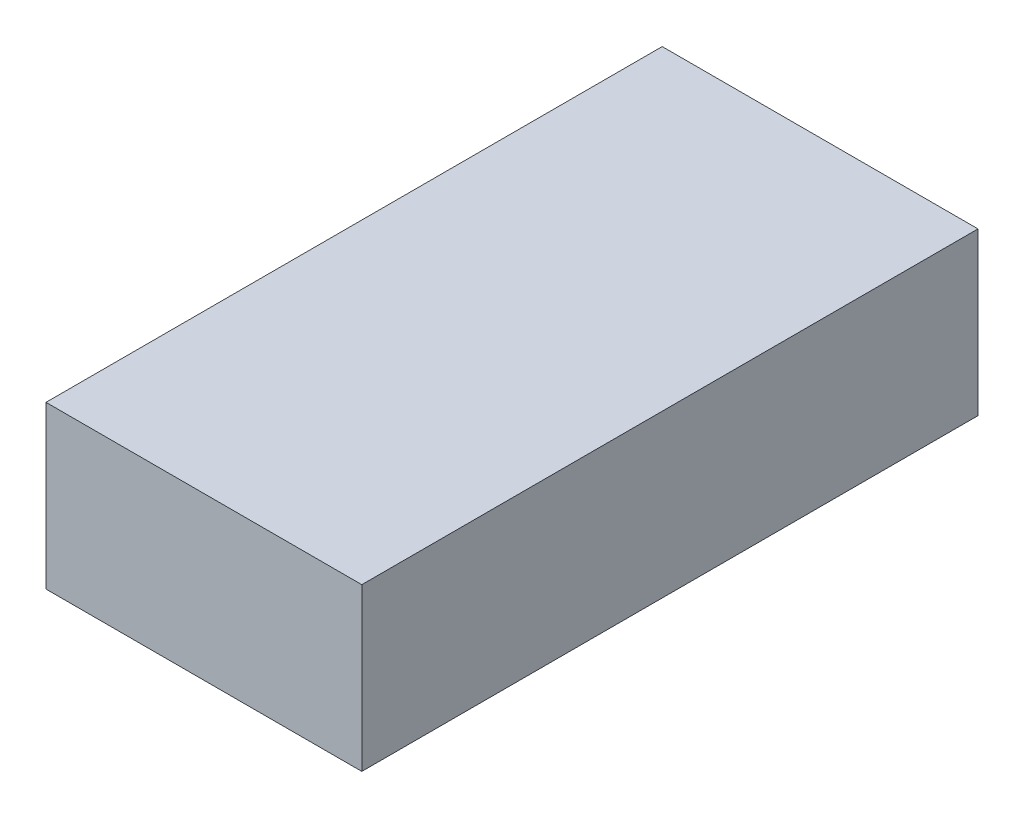
ISO-10303-21;
HEADER;
FILE_DESCRIPTION(('STEP AP214'),'2;1');
FILE_NAME('part.step','',(''),(''),'','','');
FILE_SCHEMA(('AUTOMOTIVE_DESIGN { 1 0 10303 214 1 1 1 1 }'));
ENDSEC;
DATA;
#1=APPLICATION_CONTEXT('core data for automotive mechanical design processes');
#2=APPLICATION_PROTOCOL_DEFINITION('international standard','automotive_design',2000,#1);
#3=PRODUCT_CONTEXT('',#1,'mechanical');
#4=PRODUCT('Part','Part','',(#3));
#5=PRODUCT_RELATED_PRODUCT_CATEGORY('part','',(#4));
#6=PRODUCT_DEFINITION_FORMATION('','',#4);
#7=PRODUCT_DEFINITION_CONTEXT('part definition',#1,'design');
#8=PRODUCT_DEFINITION('design','',#6,#7);
#9=PRODUCT_DEFINITION_SHAPE('','',#8);
#10=(LENGTH_UNIT() NAMED_UNIT(*) SI_UNIT(.MILLI.,.METRE.));
#11=(NAMED_UNIT(*) PLANE_ANGLE_UNIT() SI_UNIT($,.RADIAN.));
#12=(NAMED_UNIT(*) SI_UNIT($,.STERADIAN.) SOLID_ANGLE_UNIT());
#13=UNCERTAINTY_MEASURE_WITH_UNIT(LENGTH_MEASURE(1.E-05),#10,'distance_accuracy_value','');
#14=(GEOMETRIC_REPRESENTATION_CONTEXT(3) GLOBAL_UNCERTAINTY_ASSIGNED_CONTEXT((#13)) GLOBAL_UNIT_ASSIGNED_CONTEXT((#10,
#11,#12)) REPRESENTATION_CONTEXT('',''));
#15=CARTESIAN_POINT('',(0.,0.,0.));
#16=DIRECTION('',(0.,0.,1.));
#17=DIRECTION('',(1.,0.,0.));
#18=AXIS2_PLACEMENT_3D('',#15,#16,#17);
#19=CARTESIAN_POINT('',(20.5,10.5,80.));
#20=DIRECTION('',(-1.,0.,0.));
#21=DIRECTION('',(0.,-1.,0.));
#22=AXIS2_PLACEMENT_3D('',#19,#20,#21);
#23=PLANE('',#22);
#24=DIRECTION('',(0.,1.,0.));
#25=VECTOR('',#24,1.);
#26=CARTESIAN_POINT('',(20.5,10.5,0.));
#27=LINE('',#26,#25);
#28=CARTESIAN_POINT('',(20.5,-10.5,0.));
#29=VERTEX_POINT('',#28);
#30=CARTESIAN_POINT('',(20.5,10.5,0.));
#31=VERTEX_POINT('',#30);
#32=EDGE_CURVE('E94',#29,#31,#27,.T.);
#33=ORIENTED_EDGE('',*,*,#32,.T.);
#34=DIRECTION('',(0.,0.,-1.));
#35=VECTOR('',#34,1.);
#36=CARTESIAN_POINT('',(20.5,10.5,80.));
#37=LINE('',#36,#35);
#38=CARTESIAN_POINT('',(20.5,10.5,80.));
#39=VERTEX_POINT('',#38);
#40=EDGE_CURVE('E11',#39,#31,#37,.T.);
#41=ORIENTED_EDGE('',*,*,#40,.F.);
#42=DIRECTION('',(0.,1.,0.));
#43=VECTOR('',#42,1.);
#44=CARTESIAN_POINT('',(20.5,10.5,80.));
#45=LINE('',#44,#43);
#46=CARTESIAN_POINT('',(20.5,-10.5,80.));
#47=VERTEX_POINT('',#46);
#48=EDGE_CURVE('E82',#47,#39,#45,.T.);
#49=ORIENTED_EDGE('',*,*,#48,.F.);
#50=DIRECTION('',(0.,0.,-1.));
#51=VECTOR('',#50,1.);
#52=CARTESIAN_POINT('',(20.5,-10.5,80.));
#53=LINE('',#52,#51);
#54=EDGE_CURVE('E90',#47,#29,#53,.T.);
#55=ORIENTED_EDGE('',*,*,#54,.T.);
#56=EDGE_LOOP('',(#33,#41,#49,#55));
#57=FACE_BOUND('',#56,.T.);
#58=ADVANCED_FACE('F31',(#57),#23,.F.);
#59=CARTESIAN_POINT('',(-20.5,10.5,80.));
#60=DIRECTION('',(0.,-1.,0.));
#61=DIRECTION('',(0.,0.,-1.));
#62=AXIS2_PLACEMENT_3D('',#59,#60,#61);
#63=PLANE('',#62);
#64=DIRECTION('',(-1.,0.,0.));
#65=VECTOR('',#64,1.);
#66=CARTESIAN_POINT('',(-20.5,10.5,0.));
#67=LINE('',#66,#65);
#68=CARTESIAN_POINT('',(-20.5,10.5,0.));
#69=VERTEX_POINT('',#68);
#70=EDGE_CURVE('E86',#31,#69,#67,.T.);
#71=ORIENTED_EDGE('',*,*,#70,.T.);
#72=DIRECTION('',(0.,0.,-1.));
#73=VECTOR('',#72,1.);
#74=CARTESIAN_POINT('',(-20.5,10.5,80.));
#75=LINE('',#74,#73);
#76=CARTESIAN_POINT('',(-20.5,10.5,80.));
#77=VERTEX_POINT('',#76);
#78=EDGE_CURVE('E39',#77,#69,#75,.T.);
#79=ORIENTED_EDGE('',*,*,#78,.F.);
#80=DIRECTION('',(-1.,0.,0.));
#81=VECTOR('',#80,1.);
#82=CARTESIAN_POINT('',(-20.5,10.5,80.));
#83=LINE('',#82,#81);
#84=EDGE_CURVE('E77',#39,#77,#83,.T.);
#85=ORIENTED_EDGE('',*,*,#84,.F.);
#86=ORIENTED_EDGE('',*,*,#40,.T.);
#87=EDGE_LOOP('',(#71,#79,#85,#86));
#88=FACE_BOUND('',#87,.T.);
#89=ADVANCED_FACE('F85',(#88),#63,.F.);
#90=CARTESIAN_POINT('',(-20.5,10.5,80.));
#91=DIRECTION('',(1.,0.,0.));
#92=DIRECTION('',(0.,1.,0.));
#93=AXIS2_PLACEMENT_3D('',#90,#91,#92);
#94=PLANE('',#93);
#95=DIRECTION('',(0.,-1.,0.));
#96=VECTOR('',#95,1.);
#97=CARTESIAN_POINT('',(-20.5,10.5,0.));
#98=LINE('',#97,#96);
#99=CARTESIAN_POINT('',(-20.5,-10.5,0.));
#100=VERTEX_POINT('',#99);
#101=EDGE_CURVE('E64',#69,#100,#98,.T.);
#102=ORIENTED_EDGE('',*,*,#101,.T.);
#103=DIRECTION('',(0.,0.,-1.));
#104=VECTOR('',#103,1.);
#105=CARTESIAN_POINT('',(-20.5,-10.5,80.));
#106=LINE('',#105,#104);
#107=CARTESIAN_POINT('',(-20.5,-10.5,80.));
#108=VERTEX_POINT('',#107);
#109=EDGE_CURVE('E87',#108,#100,#106,.T.);
#110=ORIENTED_EDGE('',*,*,#109,.F.);
#111=DIRECTION('',(0.,-1.,0.));
#112=VECTOR('',#111,1.);
#113=CARTESIAN_POINT('',(-20.5,10.5,80.));
#114=LINE('',#113,#112);
#115=EDGE_CURVE('E80',#77,#108,#114,.T.);
#116=ORIENTED_EDGE('',*,*,#115,.F.);
#117=ORIENTED_EDGE('',*,*,#78,.T.);
#118=EDGE_LOOP('',(#102,#110,#116,#117));
#119=FACE_BOUND('',#118,.T.);
#120=ADVANCED_FACE('F88',(#119),#94,.F.);
#121=CARTESIAN_POINT('',(-20.5,-10.5,80.));
#122=DIRECTION('',(0.,1.,0.));
#123=DIRECTION('',(0.,0.,1.));
#124=AXIS2_PLACEMENT_3D('',#121,#122,#123);
#125=PLANE('',#124);
#126=DIRECTION('',(1.,0.,0.));
#127=VECTOR('',#126,1.);
#128=CARTESIAN_POINT('',(-20.5,-10.5,0.));
#129=LINE('',#128,#127);
#130=EDGE_CURVE('E70',#100,#29,#129,.T.);
#131=ORIENTED_EDGE('',*,*,#130,.T.);
#132=ORIENTED_EDGE('',*,*,#54,.F.);
#133=DIRECTION('',(1.,0.,0.));
#134=VECTOR('',#133,1.);
#135=CARTESIAN_POINT('',(-20.5,-10.5,80.));
#136=LINE('',#135,#134);
#137=EDGE_CURVE('E47',#108,#47,#136,.T.);
#138=ORIENTED_EDGE('',*,*,#137,.F.);
#139=ORIENTED_EDGE('',*,*,#109,.T.);
#140=EDGE_LOOP('',(#131,#132,#138,#139));
#141=FACE_BOUND('',#140,.T.);
#142=ADVANCED_FACE('F101',(#141),#125,.F.);
#143=CARTESIAN_POINT('',(20.5,-10.5,80.));
#144=DIRECTION('',(0.,0.,1.));
#145=DIRECTION('',(1.,0.,0.));
#146=AXIS2_PLACEMENT_3D('',#143,#144,#145);
#147=PLANE('',#146);
#148=ORIENTED_EDGE('',*,*,#48,.T.);
#149=ORIENTED_EDGE('',*,*,#84,.T.);
#150=ORIENTED_EDGE('',*,*,#115,.T.);
#151=ORIENTED_EDGE('',*,*,#137,.T.);
#152=EDGE_LOOP('',(#148,#149,#150,#151));
#153=FACE_BOUND('',#152,.T.);
#154=ADVANCED_FACE('F78',(#153),#147,.T.);
#155=CARTESIAN_POINT('',(20.5,-10.5,0.));
#156=DIRECTION('',(0.,0.,1.));
#157=DIRECTION('',(1.,0.,0.));
#158=AXIS2_PLACEMENT_3D('',#155,#156,#157);
#159=PLANE('',#158);
#160=ORIENTED_EDGE('',*,*,#32,.F.);
#161=ORIENTED_EDGE('',*,*,#130,.F.);
#162=ORIENTED_EDGE('',*,*,#101,.F.);
#163=ORIENTED_EDGE('',*,*,#70,.F.);
#164=EDGE_LOOP('',(#160,#161,#162,#163));
#165=FACE_BOUND('',#164,.T.);
#166=ADVANCED_FACE('F104',(#165),#159,.F.);
#167=CLOSED_SHELL('',(#58,#89,#120,#142,#154,#166));
#168=MANIFOLD_SOLID_BREP('B2',#167);
#169=ADVANCED_BREP_SHAPE_REPRESENTATION('',(#18,#168),#14);
#170=SHAPE_DEFINITION_REPRESENTATION(#9,#169);
ENDSEC;
END-ISO-10303-21;
